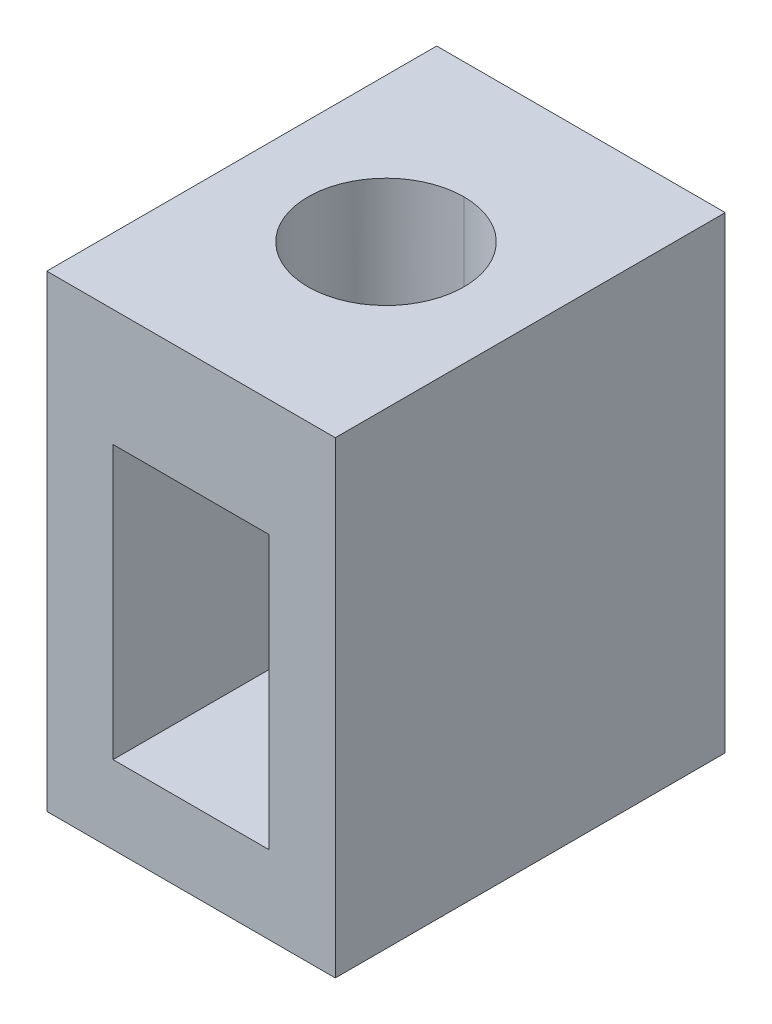
ISO-10303-21;
HEADER;
FILE_DESCRIPTION(('STEP AP214'),'2;1');
FILE_NAME('part.step','',(''),(''),'','','');
FILE_SCHEMA(('AUTOMOTIVE_DESIGN { 1 0 10303 214 1 1 1 1 }'));
ENDSEC;
DATA;
#1=APPLICATION_CONTEXT('core data for automotive mechanical design processes');
#2=APPLICATION_PROTOCOL_DEFINITION('international standard','automotive_design',2000,#1);
#3=PRODUCT_CONTEXT('',#1,'mechanical');
#4=PRODUCT('Part','Part','',(#3));
#5=PRODUCT_RELATED_PRODUCT_CATEGORY('part','',(#4));
#6=PRODUCT_DEFINITION_FORMATION('','',#4);
#7=PRODUCT_DEFINITION_CONTEXT('part definition',#1,'design');
#8=PRODUCT_DEFINITION('design','',#6,#7);
#9=PRODUCT_DEFINITION_SHAPE('','',#8);
#10=(LENGTH_UNIT() NAMED_UNIT(*) SI_UNIT(.MILLI.,.METRE.));
#11=(NAMED_UNIT(*) PLANE_ANGLE_UNIT() SI_UNIT($,.RADIAN.));
#12=(NAMED_UNIT(*) SI_UNIT($,.STERADIAN.) SOLID_ANGLE_UNIT());
#13=UNCERTAINTY_MEASURE_WITH_UNIT(LENGTH_MEASURE(1.E-05),#10,'distance_accuracy_value','');
#14=(GEOMETRIC_REPRESENTATION_CONTEXT(3) GLOBAL_UNCERTAINTY_ASSIGNED_CONTEXT((#13)) GLOBAL_UNIT_ASSIGNED_CONTEXT((#10,
#11,#12)) REPRESENTATION_CONTEXT('',''));
#15=CARTESIAN_POINT('',(0.,0.,0.));
#16=DIRECTION('',(0.,0.,1.));
#17=DIRECTION('',(1.,0.,0.));
#18=AXIS2_PLACEMENT_3D('',#15,#16,#17);
#19=CARTESIAN_POINT('',(-1.85,-3.,0.));
#20=DIRECTION('',(0.,1.,0.));
#21=DIRECTION('',(1.,0.,0.));
#22=AXIS2_PLACEMENT_3D('',#19,#20,#21);
#23=PLANE('',#22);
#24=CARTESIAN_POINT('',(1.85,-3.,-2.5));
#25=DIRECTION('',(0.,0.,1.));
#26=VECTOR('',#25,1.);
#27=LINE('',#24,#26);
#28=CARTESIAN_POINT('',(1.85,-3.,-2.5));
#29=VERTEX_POINT('',#28);
#30=CARTESIAN_POINT('',(1.85,-3.,2.5));
#31=VERTEX_POINT('',#30);
#32=EDGE_CURVE('E198',#29,#31,#27,.T.);
#33=ORIENTED_EDGE('',*,*,#32,.T.);
#34=CARTESIAN_POINT('',(1.85,-3.,2.5));
#35=DIRECTION('',(-1.,0.,0.));
#36=VECTOR('',#35,1.);
#37=LINE('',#34,#36);
#38=CARTESIAN_POINT('',(-1.85,-3.,2.5));
#39=VERTEX_POINT('',#38);
#40=EDGE_CURVE('E188',#31,#39,#37,.T.);
#41=ORIENTED_EDGE('',*,*,#40,.T.);
#42=CARTESIAN_POINT('',(-1.85,-3.,2.5));
#43=DIRECTION('',(0.,0.,-1.));
#44=VECTOR('',#43,1.);
#45=LINE('',#42,#44);
#46=CARTESIAN_POINT('',(-1.85,-3.,-2.5));
#47=VERTEX_POINT('',#46);
#48=EDGE_CURVE('E176',#39,#47,#45,.T.);
#49=ORIENTED_EDGE('',*,*,#48,.T.);
#50=CARTESIAN_POINT('',(1.85,-3.,-2.5));
#51=DIRECTION('',(-1.,0.,0.));
#52=VECTOR('',#51,1.);
#53=LINE('',#50,#52);
#54=EDGE_CURVE('E207',#29,#47,#53,.T.);
#55=ORIENTED_EDGE('',*,*,#54,.F.);
#56=EDGE_LOOP('',(#33,#41,#49,#55));
#57=FACE_BOUND('',#56,.T.);
#58=ADVANCED_FACE('F16',(#57),#23,.F.);
#59=CARTESIAN_POINT('',(-1.,-2.,0.));
#60=DIRECTION('',(0.,1.,0.));
#61=DIRECTION('',(1.,0.,0.));
#62=AXIS2_PLACEMENT_3D('',#59,#60,#61);
#63=PLANE('',#62);
#64=CARTESIAN_POINT('',(-1.,-2.,2.5));
#65=DIRECTION('',(1.,0.,0.));
#66=VECTOR('',#65,1.);
#67=LINE('',#64,#66);
#68=CARTESIAN_POINT('',(-1.,-2.,2.5));
#69=VERTEX_POINT('',#68);
#70=CARTESIAN_POINT('',(1.,-2.,2.5));
#71=VERTEX_POINT('',#70);
#72=EDGE_CURVE('E236',#69,#71,#67,.T.);
#73=ORIENTED_EDGE('',*,*,#72,.T.);
#74=CARTESIAN_POINT('',(1.,-2.,-2.5));
#75=DIRECTION('',(0.,0.,1.));
#76=VECTOR('',#75,1.);
#77=LINE('',#74,#76);
#78=CARTESIAN_POINT('',(1.,-2.,-2.5));
#79=VERTEX_POINT('',#78);
#80=EDGE_CURVE('E109',#79,#71,#77,.T.);
#81=ORIENTED_EDGE('',*,*,#80,.F.);
#82=CARTESIAN_POINT('',(-1.,-2.,-2.5));
#83=DIRECTION('',(1.,0.,0.));
#84=VECTOR('',#83,1.);
#85=LINE('',#82,#84);
#86=CARTESIAN_POINT('',(-1.,-2.,-2.5));
#87=VERTEX_POINT('',#86);
#88=EDGE_CURVE('E116',#87,#79,#85,.T.);
#89=ORIENTED_EDGE('',*,*,#88,.F.);
#90=CARTESIAN_POINT('',(-1.,-2.,2.5));
#91=DIRECTION('',(0.,0.,-1.));
#92=VECTOR('',#91,1.);
#93=LINE('',#90,#92);
#94=EDGE_CURVE('E92',#69,#87,#93,.T.);
#95=ORIENTED_EDGE('',*,*,#94,.F.);
#96=EDGE_LOOP('',(#73,#81,#89,#95));
#97=FACE_BOUND('',#96,.T.);
#98=ADVANCED_FACE('F127',(#97),#63,.T.);
#99=CARTESIAN_POINT('',(-1.,-2.,0.));
#100=DIRECTION('',(1.,0.,0.));
#101=DIRECTION('',(0.,1.,0.));
#102=AXIS2_PLACEMENT_3D('',#99,#100,#101);
#103=PLANE('',#102);
#104=CARTESIAN_POINT('',(-1.,1.5,2.5));
#105=DIRECTION('',(0.,-1.,0.));
#106=VECTOR('',#105,1.);
#107=LINE('',#104,#106);
#108=CARTESIAN_POINT('',(-1.,1.5,2.5));
#109=VERTEX_POINT('',#108);
#110=EDGE_CURVE('E101',#109,#69,#107,.T.);
#111=ORIENTED_EDGE('',*,*,#110,.T.);
#112=ORIENTED_EDGE('',*,*,#94,.T.);
#113=CARTESIAN_POINT('',(-1.,1.5,-2.5));
#114=DIRECTION('',(0.,-1.,0.));
#115=VECTOR('',#114,1.);
#116=LINE('',#113,#115);
#117=CARTESIAN_POINT('',(-1.,1.5,-2.5));
#118=VERTEX_POINT('',#117);
#119=EDGE_CURVE('E97',#118,#87,#116,.T.);
#120=ORIENTED_EDGE('',*,*,#119,.F.);
#121=CARTESIAN_POINT('',(-1.,1.5,0.));
#122=DIRECTION('',(0.,0.,-1.));
#123=VECTOR('',#122,1.);
#124=LINE('',#121,#123);
#125=CARTESIAN_POINT('',(-1.,1.5,0.));
#126=VERTEX_POINT('',#125);
#127=EDGE_CURVE('E348',#126,#118,#124,.T.);
#128=ORIENTED_EDGE('',*,*,#127,.F.);
#129=CARTESIAN_POINT('',(-1.,1.5,2.5));
#130=DIRECTION('',(0.,0.,-1.));
#131=VECTOR('',#130,1.);
#132=LINE('',#129,#131);
#133=EDGE_CURVE('E339',#109,#126,#132,.T.);
#134=ORIENTED_EDGE('',*,*,#133,.F.);
#135=EDGE_LOOP('',(#111,#112,#120,#128,#134));
#136=FACE_BOUND('',#135,.T.);
#137=ADVANCED_FACE('F95',(#136),#103,.T.);
#138=CARTESIAN_POINT('',(1.,-2.,0.));
#139=DIRECTION('',(-1.,0.,0.));
#140=DIRECTION('',(0.,0.,1.));
#141=AXIS2_PLACEMENT_3D('',#138,#139,#140);
#142=PLANE('',#141);
#143=CARTESIAN_POINT('',(1.,-2.,2.5));
#144=DIRECTION('',(0.,1.,0.));
#145=VECTOR('',#144,1.);
#146=LINE('',#143,#145);
#147=CARTESIAN_POINT('',(1.,1.5,2.5));
#148=VERTEX_POINT('',#147);
#149=EDGE_CURVE('E228',#71,#148,#146,.T.);
#150=ORIENTED_EDGE('',*,*,#149,.T.);
#151=CARTESIAN_POINT('',(1.,1.5,0.));
#152=DIRECTION('',(0.,0.,1.));
#153=VECTOR('',#152,1.);
#154=LINE('',#151,#153);
#155=CARTESIAN_POINT('',(1.,1.5,0.));
#156=VERTEX_POINT('',#155);
#157=EDGE_CURVE('E122',#156,#148,#154,.T.);
#158=ORIENTED_EDGE('',*,*,#157,.F.);
#159=CARTESIAN_POINT('',(1.,1.5,-2.5));
#160=DIRECTION('',(0.,0.,1.));
#161=VECTOR('',#160,1.);
#162=LINE('',#159,#161);
#163=CARTESIAN_POINT('',(1.,1.5,-2.5));
#164=VERTEX_POINT('',#163);
#165=EDGE_CURVE('E36',#164,#156,#162,.T.);
#166=ORIENTED_EDGE('',*,*,#165,.F.);
#167=CARTESIAN_POINT('',(1.,-2.,-2.5));
#168=DIRECTION('',(0.,1.,0.));
#169=VECTOR('',#168,1.);
#170=LINE('',#167,#169);
#171=EDGE_CURVE('E123',#79,#164,#170,.T.);
#172=ORIENTED_EDGE('',*,*,#171,.F.);
#173=ORIENTED_EDGE('',*,*,#80,.T.);
#174=EDGE_LOOP('',(#150,#158,#166,#172,#173));
#175=FACE_BOUND('',#174,.T.);
#176=ADVANCED_FACE('F267',(#175),#142,.T.);
#177=CARTESIAN_POINT('',(1.85,-3.,0.));
#178=DIRECTION('',(-1.,0.,0.));
#179=DIRECTION('',(0.,0.,1.));
#180=AXIS2_PLACEMENT_3D('',#177,#178,#179);
#181=PLANE('',#180);
#182=CARTESIAN_POINT('',(1.85,3.,-2.5));
#183=DIRECTION('',(0.,0.,1.));
#184=VECTOR('',#183,1.);
#185=LINE('',#182,#184);
#186=CARTESIAN_POINT('',(1.85,3.,-2.5));
#187=VERTEX_POINT('',#186);
#188=CARTESIAN_POINT('',(1.85,3.,2.5));
#189=VERTEX_POINT('',#188);
#190=EDGE_CURVE('E431',#187,#189,#185,.T.);
#191=ORIENTED_EDGE('',*,*,#190,.T.);
#192=CARTESIAN_POINT('',(1.85,3.,2.5));
#193=DIRECTION('',(0.,-1.,0.));
#194=VECTOR('',#193,1.);
#195=LINE('',#192,#194);
#196=EDGE_CURVE('E248',#189,#31,#195,.T.);
#197=ORIENTED_EDGE('',*,*,#196,.T.);
#198=ORIENTED_EDGE('',*,*,#32,.F.);
#199=CARTESIAN_POINT('',(1.85,3.,-2.5));
#200=DIRECTION('',(0.,-1.,0.));
#201=VECTOR('',#200,1.);
#202=LINE('',#199,#201);
#203=EDGE_CURVE('E211',#187,#29,#202,.T.);
#204=ORIENTED_EDGE('',*,*,#203,.F.);
#205=EDGE_LOOP('',(#191,#197,#198,#204));
#206=FACE_BOUND('',#205,.T.);
#207=ADVANCED_FACE('F297',(#206),#181,.F.);
#208=CARTESIAN_POINT('',(0.,-3.,2.5));
#209=DIRECTION('',(0.,0.,-1.));
#210=DIRECTION('',(0.,-1.,0.));
#211=AXIS2_PLACEMENT_3D('',#208,#209,#210);
#212=PLANE('',#211);
#213=ORIENTED_EDGE('',*,*,#72,.F.);
#214=ORIENTED_EDGE('',*,*,#110,.F.);
#215=CARTESIAN_POINT('',(1.,1.5,2.5));
#216=DIRECTION('',(-1.,0.,0.));
#217=VECTOR('',#216,1.);
#218=LINE('',#215,#217);
#219=EDGE_CURVE('E276',#148,#109,#218,.T.);
#220=ORIENTED_EDGE('',*,*,#219,.F.);
#221=ORIENTED_EDGE('',*,*,#149,.F.);
#222=EDGE_LOOP('',(#213,#214,#220,#221));
#223=FACE_BOUND('',#222,.T.);
#224=CARTESIAN_POINT('',(1.85,3.,2.5));
#225=DIRECTION('',(-1.,0.,0.));
#226=VECTOR('',#225,1.);
#227=LINE('',#224,#226);
#228=CARTESIAN_POINT('',(-1.85,3.,2.5));
#229=VERTEX_POINT('',#228);
#230=EDGE_CURVE('E451',#189,#229,#227,.T.);
#231=ORIENTED_EDGE('',*,*,#230,.T.);
#232=CARTESIAN_POINT('',(-1.85,3.,2.5));
#233=DIRECTION('',(0.,-1.,0.));
#234=VECTOR('',#233,1.);
#235=LINE('',#232,#234);
#236=EDGE_CURVE('E223',#229,#39,#235,.T.);
#237=ORIENTED_EDGE('',*,*,#236,.T.);
#238=ORIENTED_EDGE('',*,*,#40,.F.);
#239=ORIENTED_EDGE('',*,*,#196,.F.);
#240=EDGE_LOOP('',(#231,#237,#238,#239));
#241=FACE_BOUND('',#240,.T.);
#242=ADVANCED_FACE('F273',(#223,#241),#212,.F.);
#243=CARTESIAN_POINT('',(-1.85,-3.,0.));
#244=DIRECTION('',(1.,0.,0.));
#245=DIRECTION('',(0.,1.,0.));
#246=AXIS2_PLACEMENT_3D('',#243,#244,#245);
#247=PLANE('',#246);
#248=ORIENTED_EDGE('',*,*,#48,.F.);
#249=ORIENTED_EDGE('',*,*,#236,.F.);
#250=CARTESIAN_POINT('',(-1.85,3.,2.5));
#251=DIRECTION('',(0.,0.,-1.));
#252=VECTOR('',#251,1.);
#253=LINE('',#250,#252);
#254=CARTESIAN_POINT('',(-1.85,3.,-2.5));
#255=VERTEX_POINT('',#254);
#256=EDGE_CURVE('E457',#229,#255,#253,.T.);
#257=ORIENTED_EDGE('',*,*,#256,.T.);
#258=CARTESIAN_POINT('',(-1.85,-3.,-2.5));
#259=DIRECTION('',(0.,1.,0.));
#260=VECTOR('',#259,1.);
#261=LINE('',#258,#260);
#262=EDGE_CURVE('E131',#47,#255,#261,.T.);
#263=ORIENTED_EDGE('',*,*,#262,.F.);
#264=EDGE_LOOP('',(#248,#249,#257,#263));
#265=FACE_BOUND('',#264,.T.);
#266=ADVANCED_FACE('F296',(#265),#247,.F.);
#267=CARTESIAN_POINT('',(0.,-3.,-2.5));
#268=DIRECTION('',(0.,0.,-1.));
#269=DIRECTION('',(0.,-1.,0.));
#270=AXIS2_PLACEMENT_3D('',#267,#268,#269);
#271=PLANE('',#270);
#272=CARTESIAN_POINT('',(-1.,1.5,-2.5));
#273=DIRECTION('',(1.,0.,0.));
#274=VECTOR('',#273,1.);
#275=LINE('',#272,#274);
#276=EDGE_CURVE('E119',#118,#164,#275,.T.);
#277=ORIENTED_EDGE('',*,*,#276,.F.);
#278=ORIENTED_EDGE('',*,*,#119,.T.);
#279=ORIENTED_EDGE('',*,*,#88,.T.);
#280=ORIENTED_EDGE('',*,*,#171,.T.);
#281=EDGE_LOOP('',(#277,#278,#279,#280));
#282=FACE_BOUND('',#281,.T.);
#283=ORIENTED_EDGE('',*,*,#262,.T.);
#284=CARTESIAN_POINT('',(-1.85,3.,-2.5));
#285=DIRECTION('',(1.,0.,0.));
#286=VECTOR('',#285,1.);
#287=LINE('',#284,#286);
#288=EDGE_CURVE('E611',#255,#187,#287,.T.);
#289=ORIENTED_EDGE('',*,*,#288,.T.);
#290=ORIENTED_EDGE('',*,*,#203,.T.);
#291=ORIENTED_EDGE('',*,*,#54,.T.);
#292=EDGE_LOOP('',(#283,#289,#290,#291));
#293=FACE_BOUND('',#292,.T.);
#294=ADVANCED_FACE('F114',(#282,#293),#271,.T.);
#295=CARTESIAN_POINT('',(-1.,1.5,1.2425));
#296=DIRECTION('',(0.,-1.,0.));
#297=DIRECTION('',(0.,0.,-1.));
#298=AXIS2_PLACEMENT_3D('',#295,#296,#297);
#299=PLANE('',#298);
#300=ORIENTED_EDGE('',*,*,#219,.T.);
#301=ORIENTED_EDGE('',*,*,#133,.T.);
#302=CARTESIAN_POINT('',(-1.,1.5,0.));
#303=CARTESIAN_POINT('',(-1.,1.5,0.198626106562966));
#304=CARTESIAN_POINT('',(-0.923879532511284,1.5,0.382683432365097));
#305=CARTESIAN_POINT('',(-0.848070358486185,1.5,0.565988058606344));
#306=CARTESIAN_POINT('',(-0.707106781186542,1.5,0.707106781186554));
#307=CARTESIAN_POINT('',(-0.566920593389753,1.5,0.84744725866479));
#308=CARTESIAN_POINT('',(-0.382683432365081,1.5,0.92387953251129));
#309=CARTESIAN_POINT('',(-0.199462307097756,1.5,0.999890295720028));
#310=CARTESIAN_POINT('',(0.,1.5,1.));
#311=CARTESIAN_POINT('',(0.198362307319576,1.5,1.00010909928003));
#312=CARTESIAN_POINT('',(0.3826834323651,1.5,0.923879532511282));
#313=CARTESIAN_POINT('',(0.56598805860641,1.5,0.848070358486157));
#314=CARTESIAN_POINT('',(0.707106781186555,1.5,0.707106781186539));
#315=CARTESIAN_POINT('',(0.847447258664775,1.5,0.566920593389728));
#316=CARTESIAN_POINT('',(0.92387953251129,1.5,0.382683432365078));
#317=CARTESIAN_POINT('',(1.,1.5,0.199197869000174));
#318=CARTESIAN_POINT('',(1.,1.5,0.));
#319=B_SPLINE_CURVE_WITH_KNOTS('',2,(#302,#303,#304,#305,#306,#307,#308,#309,#310,#311,#312,
#313,#314,#315,#316,#317,#318),.UNSPECIFIED.,.F.,.F.,(3,2,2,2,2,2,2,2,3),(0.,0.125,0.25,0.375,
0.5,0.625,0.75,0.875,1.),.UNSPECIFIED.);
#320=CARTESIAN_POINT('',(0.,1.5,1.));
#321=VERTEX_POINT('',#320);
#322=EDGE_CURVE('E534',#126,#321,#319,.T.);
#323=ORIENTED_EDGE('',*,*,#322,.T.);
#324=CARTESIAN_POINT('',(-1.,1.5,0.));
#325=CARTESIAN_POINT('',(-1.,1.5,0.198626106562966));
#326=CARTESIAN_POINT('',(-0.923879532511284,1.5,0.382683432365097));
#327=CARTESIAN_POINT('',(-0.848070358486185,1.5,0.565988058606344));
#328=CARTESIAN_POINT('',(-0.707106781186542,1.5,0.707106781186554));
#329=CARTESIAN_POINT('',(-0.566920593389753,1.5,0.84744725866479));
#330=CARTESIAN_POINT('',(-0.382683432365081,1.5,0.92387953251129));
#331=CARTESIAN_POINT('',(-0.199462307097756,1.5,0.999890295720028));
#332=CARTESIAN_POINT('',(0.,1.5,1.));
#333=CARTESIAN_POINT('',(0.198362307319576,1.5,1.00010909928003));
#334=CARTESIAN_POINT('',(0.3826834323651,1.5,0.923879532511282));
#335=CARTESIAN_POINT('',(0.56598805860641,1.5,0.848070358486157));
#336=CARTESIAN_POINT('',(0.707106781186555,1.5,0.707106781186539));
#337=CARTESIAN_POINT('',(0.847447258664775,1.5,0.566920593389728));
#338=CARTESIAN_POINT('',(0.92387953251129,1.5,0.382683432365078));
#339=CARTESIAN_POINT('',(1.,1.5,0.199197869000174));
#340=CARTESIAN_POINT('',(1.,1.5,0.));
#341=B_SPLINE_CURVE_WITH_KNOTS('',2,(#324,#325,#326,#327,#328,#329,#330,#331,#332,#333,#334,
#335,#336,#337,#338,#339,#340),.UNSPECIFIED.,.F.,.F.,(3,2,2,2,2,2,2,2,3),(0.,0.125,0.25,0.375,
0.5,0.625,0.75,0.875,1.),.UNSPECIFIED.);
#342=EDGE_CURVE('E521',#321,#156,#341,.T.);
#343=ORIENTED_EDGE('',*,*,#342,.T.);
#344=ORIENTED_EDGE('',*,*,#157,.T.);
#345=EDGE_LOOP('',(#300,#301,#323,#343,#344));
#346=FACE_BOUND('',#345,.T.);
#347=ADVANCED_FACE('F337',(#346),#299,.T.);
#348=CARTESIAN_POINT('',(-1.,1.5,-1.2425));
#349=DIRECTION('',(0.,-1.,0.));
#350=DIRECTION('',(0.,0.,-1.));
#351=AXIS2_PLACEMENT_3D('',#348,#349,#350);
#352=PLANE('',#351);
#353=ORIENTED_EDGE('',*,*,#276,.T.);
#354=ORIENTED_EDGE('',*,*,#165,.T.);
#355=CARTESIAN_POINT('',(1.,1.5,0.));
#356=CARTESIAN_POINT('',(1.,1.5,-0.198626106562992));
#357=CARTESIAN_POINT('',(0.923879532511285,1.5,-0.38268343236509));
#358=CARTESIAN_POINT('',(0.848070358486205,1.5,-0.565988058606263));
#359=CARTESIAN_POINT('',(0.70710678118655,1.5,-0.707106781186548));
#360=CARTESIAN_POINT('',(0.566920593389865,1.5,-0.847447258664734));
#361=CARTESIAN_POINT('',(0.38268343236509,1.5,-0.923879532511287));
#362=CARTESIAN_POINT('',(0.199462307097774,1.5,-0.999890295720027));
#363=CARTESIAN_POINT('',(0.,1.5,-1.));
#364=CARTESIAN_POINT('',(-0.198362307319575,1.5,-1.00010909928003));
#365=CARTESIAN_POINT('',(-0.38268343236509,1.5,-0.923879532511287));
#366=CARTESIAN_POINT('',(-0.565988058606278,1.5,-0.848070358486212));
#367=CARTESIAN_POINT('',(-0.707106781186547,1.5,-0.707106781186548));
#368=CARTESIAN_POINT('',(-0.847447258664719,1.5,-0.566920593389862));
#369=CARTESIAN_POINT('',(-0.923879532511287,1.5,-0.38268343236509));
#370=CARTESIAN_POINT('',(-1.,1.5,-0.199197869000174));
#371=CARTESIAN_POINT('',(-1.,1.5,0.));
#372=B_SPLINE_CURVE_WITH_KNOTS('',2,(#355,#356,#357,#358,#359,#360,#361,#362,#363,#364,#365,
#366,#367,#368,#369,#370,#371),.UNSPECIFIED.,.F.,.F.,(3,2,2,2,2,2,2,2,3),(0.,0.125,0.25,0.375,
0.5,0.625,0.75,0.875,1.),.UNSPECIFIED.);
#373=CARTESIAN_POINT('',(0.,1.5,-1.));
#374=VERTEX_POINT('',#373);
#375=EDGE_CURVE('E598',#156,#374,#372,.T.);
#376=ORIENTED_EDGE('',*,*,#375,.T.);
#377=CARTESIAN_POINT('',(1.,1.5,0.));
#378=CARTESIAN_POINT('',(1.,1.5,-0.198626106562992));
#379=CARTESIAN_POINT('',(0.923879532511285,1.5,-0.38268343236509));
#380=CARTESIAN_POINT('',(0.848070358486205,1.5,-0.565988058606263));
#381=CARTESIAN_POINT('',(0.70710678118655,1.5,-0.707106781186548));
#382=CARTESIAN_POINT('',(0.566920593389865,1.5,-0.847447258664734));
#383=CARTESIAN_POINT('',(0.38268343236509,1.5,-0.923879532511287));
#384=CARTESIAN_POINT('',(0.199462307097774,1.5,-0.999890295720027));
#385=CARTESIAN_POINT('',(0.,1.5,-1.));
#386=CARTESIAN_POINT('',(-0.198362307319575,1.5,-1.00010909928003));
#387=CARTESIAN_POINT('',(-0.38268343236509,1.5,-0.923879532511287));
#388=CARTESIAN_POINT('',(-0.565988058606278,1.5,-0.848070358486212));
#389=CARTESIAN_POINT('',(-0.707106781186547,1.5,-0.707106781186548));
#390=CARTESIAN_POINT('',(-0.847447258664719,1.5,-0.566920593389862));
#391=CARTESIAN_POINT('',(-0.923879532511287,1.5,-0.38268343236509));
#392=CARTESIAN_POINT('',(-1.,1.5,-0.199197869000174));
#393=CARTESIAN_POINT('',(-1.,1.5,0.));
#394=B_SPLINE_CURVE_WITH_KNOTS('',2,(#377,#378,#379,#380,#381,#382,#383,#384,#385,#386,#387,
#388,#389,#390,#391,#392,#393),.UNSPECIFIED.,.F.,.F.,(3,2,2,2,2,2,2,2,3),(0.,0.125,0.25,0.375,
0.5,0.625,0.75,0.875,1.),.UNSPECIFIED.);
#395=EDGE_CURVE('E476',#374,#126,#394,.T.);
#396=ORIENTED_EDGE('',*,*,#395,.T.);
#397=ORIENTED_EDGE('',*,*,#127,.T.);
#398=EDGE_LOOP('',(#353,#354,#376,#396,#397));
#399=FACE_BOUND('',#398,.T.);
#400=ADVANCED_FACE('F474',(#399),#352,.T.);
#401=CARTESIAN_POINT('',(-1.85,3.,0.));
#402=DIRECTION('',(0.,-1.,0.));
#403=DIRECTION('',(0.,0.,-1.));
#404=AXIS2_PLACEMENT_3D('',#401,#402,#403);
#405=PLANE('',#404);
#406=CARTESIAN_POINT('',(0.,3.,-1.));
#407=CARTESIAN_POINT('',(0.0165433275676047,3.,-0.999992139366437));
#408=CARTESIAN_POINT('',(0.0330873764270511,3.,-0.99959021784522));
#409=CARTESIAN_POINT('',(0.0660058275030897,3.,-0.997989364009323));
#410=CARTESIAN_POINT('',(0.0823805381366532,3.,-0.99679674682789));
#411=CARTESIAN_POINT('',(0.114960551331291,3.,-0.993614810892931));
#412=CARTESIAN_POINT('',(0.131166289406728,3.,-0.991629970781109));
#413=CARTESIAN_POINT('',(0.163408113254462,3.,-0.986865869148254));
#414=CARTESIAN_POINT('',(0.179444574144974,3.,-0.984089147943355));
#415=CARTESIAN_POINT('',(0.211347993167756,3.,-0.977743192755381));
#416=CARTESIAN_POINT('',(0.22721506472231,3.,-0.974174529154446));
#417=CARTESIAN_POINT('',(0.258779928227905,3.,-0.966246563539728));
#418=CARTESIAN_POINT('',(0.274477374584543,3.,-0.96188588620026));
#419=CARTESIAN_POINT('',(0.305703731335963,3.,-0.952376358282535));
#420=CARTESIAN_POINT('',(0.321231655503033,3.,-0.947224270613042));
#421=CARTESIAN_POINT('',(0.352118718596824,3.,-0.936131777030964));
#422=CARTESIAN_POINT('',(0.367476066733318,3.,-0.930186391850353));
#423=CARTESIAN_POINT('',(0.39796522763615,3.,-0.917541805415305));
#424=CARTESIAN_POINT('',(0.413095568686483,3.,-0.910839057165135));
#425=CARTESIAN_POINT('',(0.442895226646467,3.,-0.89676250649564));
#426=CARTESIAN_POINT('',(0.457567239610705,3.,-0.889394417595456));
#427=CARTESIAN_POINT('',(0.486449680299414,3.,-0.873986916237636));
#428=CARTESIAN_POINT('',(0.500662225332707,3.,-0.865951475379363));
#429=CARTESIAN_POINT('',(0.528626615077337,3.,-0.849211592816322));
#430=CARTESIAN_POINT('',(0.542379778331761,3.,-0.840509354424754));
#431=CARTESIAN_POINT('',(0.569426209926604,3.,-0.822437550362154));
#432=CARTESIAN_POINT('',(0.582719801340867,3.,-0.813068468255586));
#433=CARTESIAN_POINT('',(0.608848029532746,3.,-0.793664631722436));
#434=CARTESIAN_POINT('',(0.621681820714639,3.,-0.783628738917067));
#435=CARTESIAN_POINT('',(0.646892074361754,3.,-0.762893271613309));
#436=CARTESIAN_POINT('',(0.659266386886184,3.,-0.752191083843523));
#437=CARTESIAN_POINT('',(0.683557398630923,3.,-0.730122988661044));
#438=CARTESIAN_POINT('',(0.695470537895111,3.,-0.718753166311159));
#439=CARTESIAN_POINT('',(0.718799975919264,3.,-0.695403394983332));
#440=CARTESIAN_POINT('',(0.73021355761409,3.,-0.683420732209785));
#441=CARTESIAN_POINT('',(0.75235798894233,3.,-0.659011859760909));
#442=CARTESIAN_POINT('',(0.763093515874362,3.,-0.646589896953472));
#443=CARTESIAN_POINT('',(0.783881216174706,3.,-0.621302390265483));
#444=CARTESIAN_POINT('',(0.793936865546606,3.,-0.6084397054053));
#445=CARTESIAN_POINT('',(0.813366517153463,3.,-0.582272561876803));
#446=CARTESIAN_POINT('',(0.822742580734845,3.,-0.568969634219864));
#447=CARTESIAN_POINT('',(0.840814445305284,3.,-0.541923243055036));
#448=CARTESIAN_POINT('',(0.849510729827764,3.,-0.528180102667452));
#449=CARTESIAN_POINT('',(0.866224538309414,3.,-0.500254455196163));
#450=CARTESIAN_POINT('',(0.874240845401302,3.,-0.486071219983071));
#451=CARTESIAN_POINT('',(0.889596962955809,3.,-0.457266599747603));
#452=CARTESIAN_POINT('',(0.896933787076465,3.,-0.442643623123992));
#453=CARTESIAN_POINT('',(0.910930661241227,3.,-0.412959593913283));
#454=CARTESIAN_POINT('',(0.917585924133134,3.,-0.397896286732069));
#455=CARTESIAN_POINT('',(0.930203943791971,3.,-0.367396121495229));
#456=CARTESIAN_POINT('',(0.936163151793415,3.,-0.3519577959952));
#457=CARTESIAN_POINT('',(0.947281067567784,3.,-0.320932631339527));
#458=CARTESIAN_POINT('',(0.952445721807153,3.,-0.305347925853517));
#459=CARTESIAN_POINT('',(0.961973942787307,3.,-0.27403020749432));
#460=CARTESIAN_POINT('',(0.966341815036392,3.,-0.258298505802552));
#461=CARTESIAN_POINT('',(0.97427874017912,3.,-0.226687811705714));
#462=CARTESIAN_POINT('',(0.977850283401222,3.,-0.210809444927592));
#463=CARTESIAN_POINT('',(0.984196303388122,3.,-0.17890603453906));
#464=CARTESIAN_POINT('',(0.986971350532339,3.,-0.162881104412657));
#465=CARTESIAN_POINT('',(0.991726213473518,3.,-0.130685072684161));
#466=CARTESIAN_POINT('',(0.99370462638865,3.,-0.114513764053179));
#467=CARTESIAN_POINT('',(0.996868778156412,3.,-0.0820252332023179));
#468=CARTESIAN_POINT('',(0.998051148909403,3.,-0.0657076833582265));
#469=CARTESIAN_POINT('',(0.999622988284578,3.,-0.0329268444802445));
#470=CARTESIAN_POINT('',(1.00000717135901,3.,-0.0164633044368317));
#471=CARTESIAN_POINT('',(0.999992793542096,3.,0.0165438810363891));
#472=CARTESIAN_POINT('',(0.999590392452284,3.,0.0330875241542875));
#473=CARTESIAN_POINT('',(0.997989190780278,3.,0.0660056809417468));
#474=CARTESIAN_POINT('',(0.996796700536741,3.,0.0823804989717929));
#475=CARTESIAN_POINT('',(0.993614856926006,3.,0.114960590277832));
#476=CARTESIAN_POINT('',(0.991629983097209,3.,0.131166299826844));
#477=CARTESIAN_POINT('',(0.986865856871226,3.,0.163408102867434));
#478=CARTESIAN_POINT('',(0.984089144654602,3.,0.179444571362524));
#479=CARTESIAN_POINT('',(0.977743196041771,3.,0.21134799594824));
#480=CARTESIAN_POINT('',(0.974174530035885,3.,0.227215065468071));
#481=CARTESIAN_POINT('',(0.966246562656742,3.,0.258779927480865));
#482=CARTESIAN_POINT('',(0.961885885963148,3.,0.274477374383948));
#483=CARTESIAN_POINT('',(0.95237635852064,3.,0.305703731537426));
#484=CARTESIAN_POINT('',(0.947224270677044,3.,0.321231655557193));
#485=CARTESIAN_POINT('',(0.936131776966535,3.,0.352118718542321));
#486=CARTESIAN_POINT('',(0.930186391833053,3.,0.367476066718687));
#487=CARTESIAN_POINT('',(0.917541805432679,3.,0.39796522765087));
#488=CARTESIAN_POINT('',(0.910839057169759,3.,0.413095568690435));
#489=CARTESIAN_POINT('',(0.896762506491011,3.,0.442895226642624));
#490=CARTESIAN_POINT('',(0.889394417594197,3.,0.457567239609728));
#491=CARTESIAN_POINT('',(0.87398691623882,3.,0.486449680300521));
#492=CARTESIAN_POINT('',(0.865951475379645,3.,0.500662225333053));
#493=CARTESIAN_POINT('',(0.849211592815956,3.,0.52862661507716));
#494=CARTESIAN_POINT('',(0.84050935442464,3.,0.542379778331818));
#495=CARTESIAN_POINT('',(0.822437550362181,3.,0.569426209926727));
#496=CARTESIAN_POINT('',(0.813068468255504,3.,0.582719801340825));
#497=CARTESIAN_POINT('',(0.793664631722436,3.,0.608848029532957));
#498=CARTESIAN_POINT('',(0.783628738917258,3.,0.62168182071527));
#499=CARTESIAN_POINT('',(0.762893271613054,3.,0.646892074361254));
#500=CARTESIAN_POINT('',(0.752191083842625,3.,0.659266386884124));
#501=CARTESIAN_POINT('',(0.730122988661914,3.,0.683557398633072));
#502=CARTESIAN_POINT('',(0.718753166314461,3.,0.695470537903078));
#503=CARTESIAN_POINT('',(0.695403394979996,3.,0.718799975911278));
#504=CARTESIAN_POINT('',(0.683420732197324,3.,0.730213557584199));
#505=CARTESIAN_POINT('',(0.659011859773182,3.,0.752357988972034));
#506=CARTESIAN_POINT('',(0.646589896999268,3.,0.763093515984752));
#507=CARTESIAN_POINT('',(0.621302390219782,3.,0.78388121606502));
#508=CARTESIAN_POINT('',(0.608439705235463,3.,0.793936865138283));
#509=CARTESIAN_POINT('',(0.582272562045897,3.,0.813366517560604));
#510=CARTESIAN_POINT('',(0.56896963485016,3.,0.822742582251609));
#511=CARTESIAN_POINT('',(0.541923242424973,3.,0.840814443789732));
#512=CARTESIAN_POINT('',(0.528180100317392,3.,0.849510724174043));
#513=CARTESIAN_POINT('',(0.500254457550137,3.,0.866224543973165));
#514=CARTESIAN_POINT('',(0.486071228775359,3.,0.874240866555061));
#515=CARTESIAN_POINT('',(0.457266590918179,3.,0.889596941713193));
#516=CARTESIAN_POINT('',(0.442643590106186,3.,0.896933707638651));
#517=CARTESIAN_POINT('',(0.412959627148948,3.,0.910930741203474));
#518=CARTESIAN_POINT('',(0.397896411167329,3.,0.917586223513698));
#519=CARTESIAN_POINT('',(0.367415227496942,3.,0.930195687442075));
#520=CARTESIAN_POINT('',(0.351996170498337,3.,0.93614703476855));
#521=CARTESIAN_POINT('',(0.321004040736801,3.,0.947251476746339));
#522=CARTESIAN_POINT('',(0.305433005883488,3.,0.952410251939133));
#523=CARTESIAN_POINT('',(0.274137262706825,3.,0.961929333118373));
#524=CARTESIAN_POINT('',(0.258413779470348,3.,0.966293663308672));
#525=CARTESIAN_POINT('',(0.226814103288279,3.,0.97422605667823));
#526=CARTESIAN_POINT('',(0.210938463859331,3.,0.977796323700983));
#527=CARTESIAN_POINT('',(0.17903509448872,3.,0.984142301671794));
#528=CARTESIAN_POINT('',(0.163007421274763,3.,0.986918297798407));
#529=CARTESIAN_POINT('',(0.130800433040307,3.,0.991677820968818));
#530=CARTESIAN_POINT('',(0.114620869970484,3.,0.993659668879519));
#531=CARTESIAN_POINT('',(0.0821104854884496,3.,0.996832460764728));
#532=CARTESIAN_POINT('',(0.0657793108441439,3.,0.99801977208258));
#533=CARTESIAN_POINT('',(0.0329653319842504,3.,0.999606935531407));
#534=CARTESIAN_POINT('',(0.0164822604928745,3.,1.00000128202445));
#535=CARTESIAN_POINT('',(0.,3.,1.));
#536=B_SPLINE_CURVE_WITH_KNOTS('',3,(#406,#407,#408,#409,#410,#411,#412,#413,#414,#415,#416,
#417,#418,#419,#420,#421,#422,#423,#424,#425,#426,#427,#428,#429,#430,#431,#432,#433,#434,#435,
#436,#437,#438,#439,#440,#441,#442,#443,#444,#445,#446,#447,#448,#449,#450,#451,#452,#453,#454,
#455,#456,#457,#458,#459,#460,#461,#462,#463,#464,#465,#466,#467,#468,#469,#470,#471,#472,#473,
#474,#475,#476,#477,#478,#479,#480,#481,#482,#483,#484,#485,#486,#487,#488,#489,#490,#491,#492,
#493,#494,#495,#496,#497,#498,#499,#500,#501,#502,#503,#504,#505,#506,#507,#508,#509,#510,#511,
#512,#513,#514,#515,#516,#517,#518,#519,#520,#521,#522,#523,#524,#525,#526,#527,#528,#529,#530,
#531,#532,#533,#534,#535),.UNSPECIFIED.,.F.,.F.,(4,2,2,2,2,2,2,2,2,2,2,2,2,2,2,2,2,2,2,2,2,2,2,
2,2,2,2,2,2,2,2,2,2,2,2,2,2,2,2,2,2,2,2,2,2,2,2,2,2,2,2,2,2,2,2,2,2,2,2,2,2,2,2,2,4),(0.,
0.0496266442037793,0.0988616293150856,0.147822131624161,0.19662730447774,0.24539743972097,
0.29425308800735,0.343314169638173,0.392699108390333,0.442325752594089,0.491560737705379,
0.540521240014445,0.589326412868021,0.638096548111254,0.686952196397644,0.736013278028485,
0.785398216780668,0.835024860984413,0.884259846095695,0.933220348404755,0.982025521258329,
1.03079565650156,1.07965130478796,1.12871238641881,1.178097325171,1.22772396937477,
1.27695895448607,1.32591945679514,1.37472462964872,1.42349476489195,1.47235041317833,
1.52141149480917,1.57079643356134,1.62042307776512,1.66965806287643,1.71861856518551,
1.76742373803909,1.81619387328232,1.8650495215687,1.91411060319952,1.96349554195167,
2.01312218615547,2.06235717126679,2.11131767357588,2.16012284642946,2.20889298167269,
2.25774862995906,2.30680971158987,2.35619465034201,2.40582129454581,2.45505627965713,
2.50401678196621,2.5528219548198,2.60159209006302,2.65044773834939,2.6995088199802,
2.74889375873234,2.79845797439782,2.84764847168491,2.89658240841449,2.94537879041198,
2.99415763029078,3.04303906987151,3.0921424978856,3.14158569500787),.UNSPECIFIED.);
#537=CARTESIAN_POINT('',(0.,3.,-1.));
#538=VERTEX_POINT('',#537);
#539=CARTESIAN_POINT('',(0.,3.,1.));
#540=VERTEX_POINT('',#539);
#541=EDGE_CURVE('E579',#538,#540,#536,.T.);
#542=ORIENTED_EDGE('',*,*,#541,.T.);
#543=CARTESIAN_POINT('',(0.,3.,1.));
#544=CARTESIAN_POINT('',(-0.0165238885816204,3.,1.00000126021956));
#545=CARTESIAN_POINT('',(-0.0330486794516878,3.,0.999607212181263));
#546=CARTESIAN_POINT('',(-0.0659341432118989,3.,0.998020061021399));
#547=CARTESIAN_POINT('',(-0.0822951107019525,3.,0.996833036999463));
#548=CARTESIAN_POINT('',(-0.1148531551129,3.,0.993660242905121));
#549=CARTESIAN_POINT('',(-0.131050641569418,3.,0.991678692779433));
#550=CARTESIAN_POINT('',(-0.163281499081675,3.,0.986919156087025));
#551=CARTESIAN_POINT('',(-0.179315204436279,3.,0.984143434587934));
#552=CARTESIAN_POINT('',(-0.211218660360078,3.,0.97779746951847));
#553=CARTESIAN_POINT('',(-0.227088467652744,3.,0.974227511174272));
#554=CARTESIAN_POINT('',(-0.258664377293846,3.,0.96629497999957));
#555=CARTESIAN_POINT('',(-0.274370061611447,3.,0.961930744045666));
#556=CARTESIAN_POINT('',(-0.305618446431546,3.,0.95241202779366));
#557=CARTESIAN_POINT('',(-0.321160073985733,3.,0.94725402697921));
#558=CARTESIAN_POINT('',(-0.352080252159255,3.,0.936147983708771));
#559=CARTESIAN_POINT('',(-0.367456914318919,3.,0.930194691321409));
#560=CARTESIAN_POINT('',(-0.397965100405173,3.,0.917541500384437));
#561=CARTESIAN_POINT('',(-0.413095534727077,3.,0.910838975748856));
#562=CARTESIAN_POINT('',(-0.442895260337914,3.,0.896762587269352));
#563=CARTESIAN_POINT('',(-0.457567248613937,3.,0.889394439180206));
#564=CARTESIAN_POINT('',(-0.486449671346466,3.,0.873986894773183));
#565=CARTESIAN_POINT('',(-0.500662222937396,3.,0.865951469636556));
#566=CARTESIAN_POINT('',(-0.528626617465162,3.,0.849211598540864));
#567=CARTESIAN_POINT('',(-0.542379778971453,3.,0.840509355958219));
#568=CARTESIAN_POINT('',(-0.569426209287493,3.,0.822437548829742));
#569=CARTESIAN_POINT('',(-0.582719801169495,3.,0.813068467844562));
#570=CARTESIAN_POINT('',(-0.608848029704533,3.,0.793664632134135));
#571=CARTESIAN_POINT('',(-0.621681820760804,3.,0.783628739027607));
#572=CARTESIAN_POINT('',(-0.646892074315484,3.,0.762893271502268));
#573=CARTESIAN_POINT('',(-0.659266386873769,3.,0.752191083813666));
#574=CARTESIAN_POINT('',(-0.683557398643471,3.,0.730122988691078));
#575=CARTESIAN_POINT('',(-0.695470537898483,3.,0.718753166319221));
#576=CARTESIAN_POINT('',(-0.718799975915888,3.,0.695403394975215));
#577=CARTESIAN_POINT('',(-0.730213557613199,3.,0.683420732207597));
#578=CARTESIAN_POINT('',(-0.752357988943247,3.,0.659011859763009));
#579=CARTESIAN_POINT('',(-0.763093515874629,3.,0.646589896953991));
#580=CARTESIAN_POINT('',(-0.783881216174503,3.,0.621302390264844));
#581=CARTESIAN_POINT('',(-0.79393686554658,3.,0.608439705405073));
#582=CARTESIAN_POINT('',(-0.813366517153568,3.,0.582272561876875));
#583=CARTESIAN_POINT('',(-0.822742580734905,3.,0.568969634219822));
#584=CARTESIAN_POINT('',(-0.840814445305311,3.,0.541923243054913));
#585=CARTESIAN_POINT('',(-0.849510729827802,3.,0.52818010266736));
#586=CARTESIAN_POINT('',(-0.866224538309458,3.,0.500254455196101));
#587=CARTESIAN_POINT('',(-0.874240845401339,3.,0.486071219983005));
#588=CARTESIAN_POINT('',(-0.889596962955837,3.,0.457266599747546));
#589=CARTESIAN_POINT('',(-0.896933787076491,3.,0.442643623123946));
#590=CARTESIAN_POINT('',(-0.910930661241242,3.,0.412959593913259));
#591=CARTESIAN_POINT('',(-0.917585924133143,3.,0.397896286732057));
#592=CARTESIAN_POINT('',(-0.930203943791973,3.,0.367396121495225));
#593=CARTESIAN_POINT('',(-0.936163151793416,3.,0.351957795995193));
#594=CARTESIAN_POINT('',(-0.947281067567785,3.,0.320932631339514));
#595=CARTESIAN_POINT('',(-0.952445721807155,3.,0.305347925853501));
#596=CARTESIAN_POINT('',(-0.961973942787309,3.,0.2740302074943));
#597=CARTESIAN_POINT('',(-0.966341815036393,3.,0.258298505802531));
#598=CARTESIAN_POINT('',(-0.97427874017912,3.,0.226687811705692));
#599=CARTESIAN_POINT('',(-0.977850283401222,3.,0.210809444927568));
#600=CARTESIAN_POINT('',(-0.984196303388122,3.,0.178906034539037));
#601=CARTESIAN_POINT('',(-0.986971350532339,3.,0.162881104412634));
#602=CARTESIAN_POINT('',(-0.991726213473518,3.,0.130685072684141));
#603=CARTESIAN_POINT('',(-0.993704626388649,3.,0.11451376405316));
#604=CARTESIAN_POINT('',(-0.996868778156412,3.,0.0820252332023025));
#605=CARTESIAN_POINT('',(-0.998051148909402,3.,0.0657076833582137));
#606=CARTESIAN_POINT('',(-0.999622988284578,3.,0.0329268444802376));
#607=CARTESIAN_POINT('',(-1.00000717135901,3.,0.0164633044368282));
#608=CARTESIAN_POINT('',(-0.999992793542096,3.,-0.0165438810363856));
#609=CARTESIAN_POINT('',(-0.999590392452284,3.,-0.0330875241542806));
#610=CARTESIAN_POINT('',(-0.997989190780278,3.,-0.0660056809417339));
#611=CARTESIAN_POINT('',(-0.996796700536742,3.,-0.0823804989717775));
#612=CARTESIAN_POINT('',(-0.993614856926007,3.,-0.114960590277813));
#613=CARTESIAN_POINT('',(-0.99162998309721,3.,-0.131166299826823));
#614=CARTESIAN_POINT('',(-0.986865856871227,3.,-0.163408102867411));
#615=CARTESIAN_POINT('',(-0.984089144654603,3.,-0.179444571362501));
#616=CARTESIAN_POINT('',(-0.977743196041772,3.,-0.211347995948217));
#617=CARTESIAN_POINT('',(-0.974174530035885,3.,-0.227215065468048));
#618=CARTESIAN_POINT('',(-0.966246562656743,3.,-0.258779927480844));
#619=CARTESIAN_POINT('',(-0.96188588596315,3.,-0.274477374383929));
#620=CARTESIAN_POINT('',(-0.952376358520641,3.,-0.30570373153741));
#621=CARTESIAN_POINT('',(-0.947224270677046,3.,-0.32123165555718));
#622=CARTESIAN_POINT('',(-0.936131776966537,3.,-0.352118718542314));
#623=CARTESIAN_POINT('',(-0.930186391833054,3.,-0.367476066718683));
#624=CARTESIAN_POINT('',(-0.917541805432683,3.,-0.397965227650868));
#625=CARTESIAN_POINT('',(-0.910839057169766,3.,-0.413095568690431));
#626=CARTESIAN_POINT('',(-0.896762506491021,3.,-0.442895226642614));
#627=CARTESIAN_POINT('',(-0.889394417594207,3.,-0.457567239609714));
#628=CARTESIAN_POINT('',(-0.873986916238836,3.,-0.486449680300511));
#629=CARTESIAN_POINT('',(-0.865951475379665,3.,-0.50066222533305));
#630=CARTESIAN_POINT('',(-0.849211592815968,3.,-0.528626615077134));
#631=CARTESIAN_POINT('',(-0.840509354424639,3.,-0.542379778331762));
#632=CARTESIAN_POINT('',(-0.822437550362214,3.,-0.569426209926752));
#633=CARTESIAN_POINT('',(-0.813068468255583,3.,-0.58271980134096));
#634=CARTESIAN_POINT('',(-0.793664631722389,3.,-0.608848029532793));
#635=CARTESIAN_POINT('',(-0.783628738917038,3.,-0.621681820714695));
#636=CARTESIAN_POINT('',(-0.762893271613298,3.,-0.646892074361808));
#637=CARTESIAN_POINT('',(-0.752191083843511,3.,-0.659266386886226));
#638=CARTESIAN_POINT('',(-0.730122988661035,3.,-0.683557398630943));
#639=CARTESIAN_POINT('',(-0.718753166311155,3.,-0.695470537895123));
#640=CARTESIAN_POINT('',(-0.695403394983316,3.,-0.718799975919271));
#641=CARTESIAN_POINT('',(-0.683420732209752,3.,-0.730213557614101));
#642=CARTESIAN_POINT('',(-0.659011859760842,3.,-0.752357988942375));
#643=CARTESIAN_POINT('',(-0.64658989695339,3.,-0.763093515874438));
#644=CARTESIAN_POINT('',(-0.621302390265389,3.,-0.783881216174731));
#645=CARTESIAN_POINT('',(-0.60843970540521,3.,-0.793936865546551));
#646=CARTESIAN_POINT('',(-0.582272561876672,3.,-0.813366517153645));
#647=CARTESIAN_POINT('',(-0.568969634219687,3.,-0.822742580735343));
#648=CARTESIAN_POINT('',(-0.541923243054976,3.,-0.840814445304925));
#649=CARTESIAN_POINT('',(-0.528180102667555,3.,-0.849510729826233));
#650=CARTESIAN_POINT('',(-0.500254455195838,3.,-0.866224538311078));
#651=CARTESIAN_POINT('',(-0.486071219982152,3.,-0.874240845407341));
#652=CARTESIAN_POINT('',(-0.457266599748348,3.,-0.889596962949849));
#653=CARTESIAN_POINT('',(-0.442643623127006,3.,-0.896933787054043));
#654=CARTESIAN_POINT('',(-0.412959593910148,3.,-0.910930661263861));
#655=CARTESIAN_POINT('',(-0.397896286720446,3.,-0.917585924217803));
#656=CARTESIAN_POINT('',(-0.367396121506883,3.,-0.930203943706902));
#657=CARTESIAN_POINT('',(-0.351957796038817,3.,-0.936163151475134));
#658=CARTESIAN_POINT('',(-0.320932631296212,3.,-0.947281067883556));
#659=CARTESIAN_POINT('',(-0.305347925692496,3.,-0.952445722981521));
#660=CARTESIAN_POINT('',(-0.274030207654367,3.,-0.961973941619488));
#661=CARTESIAN_POINT('',(-0.258298506398274,3.,-0.966341810690395));
#662=CARTESIAN_POINT('',(-0.226687811111787,3.,-0.97427874451133));
#663=CARTESIAN_POINT('',(-0.210809442714874,3.,-0.977850299542152));
#664=CARTESIAN_POINT('',(-0.178906036750087,3.,-0.984196287258779));
#665=CARTESIAN_POINT('',(-0.162881112660718,3.,-0.986971290364119));
#666=CARTESIAN_POINT('',(-0.130685064421542,3.,-0.991726273747236));
#667=CARTESIAN_POINT('',(-0.114513733192707,3.,-0.993704851508933));
#668=CARTESIAN_POINT('',(-0.0820252641924788,3.,-0.996868552089518));
#669=CARTESIAN_POINT('',(-0.0657077992473929,3.,-0.998050303522323));
#670=CARTESIAN_POINT('',(-0.0329267278260388,3.,-0.999623839252141));
#671=CARTESIAN_POINT('',(-0.0164628676806533,3.,-1.00001035740259));
#672=CARTESIAN_POINT('',(0.,3.,-1.));
#673=B_SPLINE_CURVE_WITH_KNOTS('',3,(#543,#544,#545,#546,#547,#548,#549,#550,#551,#552,#553,
#554,#555,#556,#557,#558,#559,#560,#561,#562,#563,#564,#565,#566,#567,#568,#569,#570,#571,#572,
#573,#574,#575,#576,#577,#578,#579,#580,#581,#582,#583,#584,#585,#586,#587,#588,#589,#590,#591,
#592,#593,#594,#595,#596,#597,#598,#599,#600,#601,#602,#603,#604,#605,#606,#607,#608,#609,#610,
#611,#612,#613,#614,#615,#616,#617,#618,#619,#620,#621,#622,#623,#624,#625,#626,#627,#628,#629,
#630,#631,#632,#633,#634,#635,#636,#637,#638,#639,#640,#641,#642,#643,#644,#645,#646,#647,#648,
#649,#650,#651,#652,#653,#654,#655,#656,#657,#658,#659,#660,#661,#662,#663,#664,#665,#666,#667,
#668,#669,#670,#671,#672),.UNSPECIFIED.,.F.,.F.,(4,2,2,2,2,2,2,2,2,2,2,2,2,2,2,2,2,2,2,2,2,2,2,
2,2,2,2,2,2,2,2,2,2,2,2,2,2,2,2,2,2,2,2,2,2,2,2,2,2,2,2,2,2,2,2,2,2,2,2,2,2,2,2,2,4),(0.,
0.0495682340535561,0.0987607641974537,0.147695408771797,0.19649185413583,0.245270803935941,
0.294153091422587,0.34325878701018,0.392706333675757,0.442332977879543,0.491567962990853,
0.540528465299931,0.589333638153511,0.63810377339674,0.686959421683118,0.736020503313938,
0.785405442066094,0.83503208626988,0.88426707138119,0.933227573690269,0.982032746543849,
1.03080288178708,1.07965853007345,1.12871961170427,1.17810455045643,1.22773119466021,
1.27696617977151,1.32592668208059,1.37473185493417,1.4235019901774,1.47235763846378,
1.5214187200946,1.57080365884676,1.62043030305054,1.66966528816184,1.71862579047091,
1.76743096332449,1.81620109856772,1.86505674685411,1.91411782848493,1.96350276723709,
2.01312941144089,2.0623643965522,2.11132489886128,2.16013007171486,2.20890020695809,
2.25775585524446,2.30681693687528,2.35620187562743,2.40582851983124,2.45506350494256,
2.50402400725165,2.55282918010523,2.60159931534846,2.65045496363483,2.69951604526563,
2.74890098401776,2.79852762822156,2.84776261333287,2.89672311564195,2.94552828849553,
2.99429842373876,3.04315407202514,3.09221515365595,3.1416000924081),.UNSPECIFIED.);
#674=EDGE_CURVE('E28',#540,#538,#673,.T.);
#675=ORIENTED_EDGE('',*,*,#674,.T.);
#676=EDGE_LOOP('',(#542,#675));
#677=FACE_BOUND('',#676,.T.);
#678=ORIENTED_EDGE('',*,*,#256,.F.);
#679=ORIENTED_EDGE('',*,*,#230,.F.);
#680=ORIENTED_EDGE('',*,*,#190,.F.);
#681=ORIENTED_EDGE('',*,*,#288,.F.);
#682=EDGE_LOOP('',(#678,#679,#680,#681));
#683=FACE_BOUND('',#682,.T.);
#684=ADVANCED_FACE('F496',(#677,#683),#405,.F.);
#685=CARTESIAN_POINT('',(0.,2.25,0.));
#686=DIRECTION('',(0.,1.,0.));
#687=DIRECTION('',(0.,0.,1.));
#688=AXIS2_PLACEMENT_3D('',#685,#686,#687);
#689=CYLINDRICAL_SURFACE('',#688,1.);
#690=ORIENTED_EDGE('',*,*,#375,.F.);
#691=ORIENTED_EDGE('',*,*,#342,.F.);
#692=CARTESIAN_POINT('',(0.,1.5,1.));
#693=DIRECTION('',(0.,1.,0.));
#694=VECTOR('',#693,1.);
#695=LINE('',#692,#694);
#696=EDGE_CURVE('E577',#321,#540,#695,.T.);
#697=ORIENTED_EDGE('',*,*,#696,.T.);
#698=ORIENTED_EDGE('',*,*,#541,.F.);
#699=CARTESIAN_POINT('',(0.,3.,-1.));
#700=DIRECTION('',(0.,-1.,0.));
#701=VECTOR('',#700,1.);
#702=LINE('',#699,#701);
#703=EDGE_CURVE('E11',#538,#374,#702,.T.);
#704=ORIENTED_EDGE('',*,*,#703,.T.);
#705=EDGE_LOOP('',(#690,#691,#697,#698,#704));
#706=FACE_BOUND('',#705,.T.);
#707=ADVANCED_FACE('F549',(#706),#689,.F.);
#708=CARTESIAN_POINT('',(0.,2.25,0.));
#709=DIRECTION('',(0.,1.,0.));
#710=DIRECTION('',(0.,0.,1.));
#711=AXIS2_PLACEMENT_3D('',#708,#709,#710);
#712=CYLINDRICAL_SURFACE('',#711,1.);
#713=ORIENTED_EDGE('',*,*,#674,.F.);
#714=ORIENTED_EDGE('',*,*,#696,.F.);
#715=ORIENTED_EDGE('',*,*,#322,.F.);
#716=ORIENTED_EDGE('',*,*,#395,.F.);
#717=ORIENTED_EDGE('',*,*,#703,.F.);
#718=EDGE_LOOP('',(#713,#714,#715,#716,#717));
#719=FACE_BOUND('',#718,.T.);
#720=ADVANCED_FACE('F558',(#719),#712,.F.);
#721=CLOSED_SHELL('',(#58,#98,#137,#176,#207,#242,#266,#294,#347,#400,#684,#707,#720));
#722=MANIFOLD_SOLID_BREP('B1',#721);
#723=ADVANCED_BREP_SHAPE_REPRESENTATION('',(#18,#722),#14);
#724=SHAPE_DEFINITION_REPRESENTATION(#9,#723);
ENDSEC;
END-ISO-10303-21;
